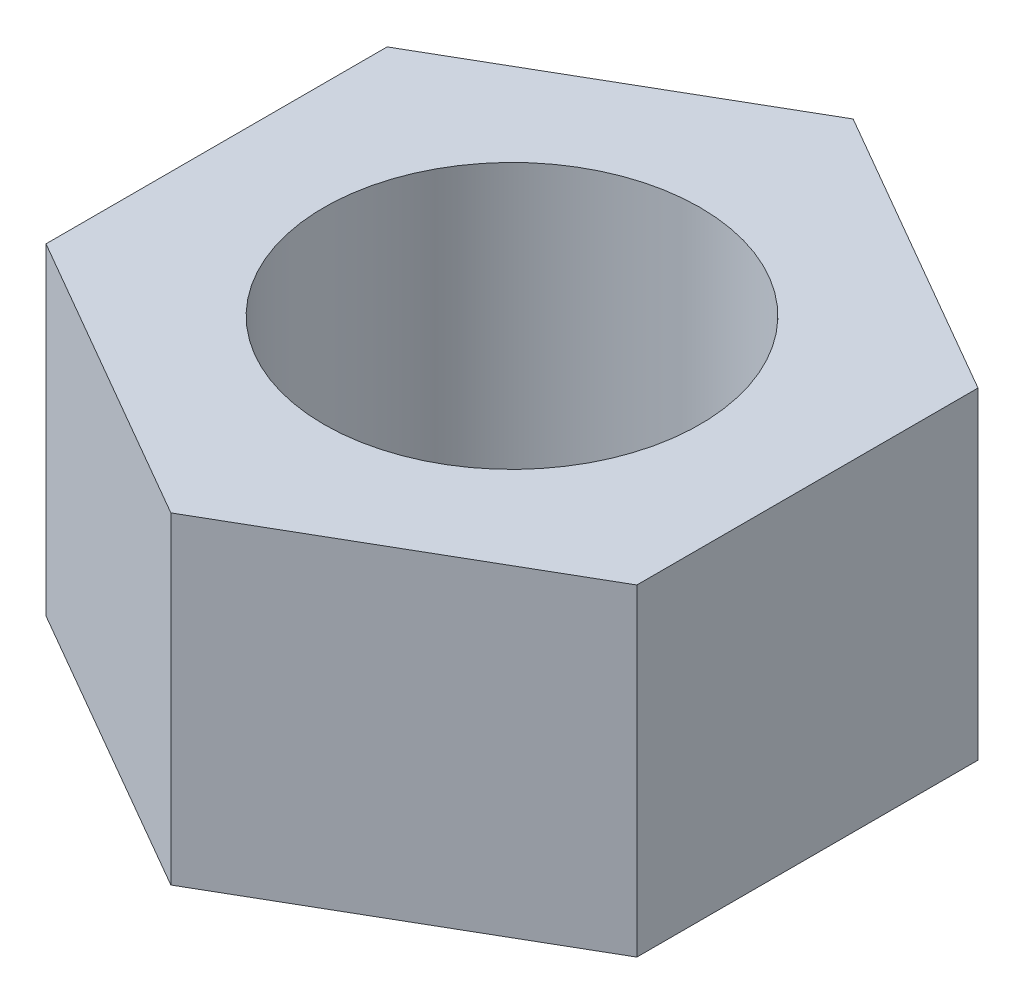
ISO-10303-21;
HEADER;
FILE_DESCRIPTION(('STEP AP214'),'2;1');
FILE_NAME('part.step','',(''),(''),'','','');
FILE_SCHEMA(('AUTOMOTIVE_DESIGN { 1 0 10303 214 1 1 1 1 }'));
ENDSEC;
DATA;
#1=APPLICATION_CONTEXT('core data for automotive mechanical design processes');
#2=APPLICATION_PROTOCOL_DEFINITION('international standard','automotive_design',2000,#1);
#3=PRODUCT_CONTEXT('',#1,'mechanical');
#4=PRODUCT('Part','Part','',(#3));
#5=PRODUCT_RELATED_PRODUCT_CATEGORY('part','',(#4));
#6=PRODUCT_DEFINITION_FORMATION('','',#4);
#7=PRODUCT_DEFINITION_CONTEXT('part definition',#1,'design');
#8=PRODUCT_DEFINITION('design','',#6,#7);
#9=PRODUCT_DEFINITION_SHAPE('','',#8);
#10=(LENGTH_UNIT() NAMED_UNIT(*) SI_UNIT(.MILLI.,.METRE.));
#11=(NAMED_UNIT(*) PLANE_ANGLE_UNIT() SI_UNIT($,.RADIAN.));
#12=(NAMED_UNIT(*) SI_UNIT($,.STERADIAN.) SOLID_ANGLE_UNIT());
#13=UNCERTAINTY_MEASURE_WITH_UNIT(LENGTH_MEASURE(1.E-05),#10,'distance_accuracy_value','');
#14=(GEOMETRIC_REPRESENTATION_CONTEXT(3) GLOBAL_UNCERTAINTY_ASSIGNED_CONTEXT((#13)) GLOBAL_UNIT_ASSIGNED_CONTEXT((#10,
#11,#12)) REPRESENTATION_CONTEXT('',''));
#15=CARTESIAN_POINT('',(0.,0.,0.));
#16=DIRECTION('',(0.,0.,1.));
#17=DIRECTION('',(1.,0.,0.));
#18=AXIS2_PLACEMENT_3D('',#15,#16,#17);
#19=CARTESIAN_POINT('',(5.49999999999997,6.,-3.17542648054301));
#20=DIRECTION('',(-0.499999999999995,0.,0.866025403784441));
#21=DIRECTION('',(0.866025403784442,0.,0.499999999999995));
#22=AXIS2_PLACEMENT_3D('',#19,#20,#21);
#23=PLANE('',#22);
#24=DIRECTION('',(-0.866025403784442,0.,-0.499999999999995));
#25=VECTOR('',#24,1.);
#26=CARTESIAN_POINT('',(5.49999999999997,0.,-3.17542648054301));
#27=LINE('',#26,#25);
#28=CARTESIAN_POINT('',(5.49999999999997,0.,-3.17542648054301));
#29=VERTEX_POINT('',#28);
#30=CARTESIAN_POINT('',(0.,0.,-6.35085296108589));
#31=VERTEX_POINT('',#30);
#32=EDGE_CURVE('E117',#29,#31,#27,.T.);
#33=ORIENTED_EDGE('',*,*,#32,.T.);
#34=DIRECTION('',(0.,-1.,0.));
#35=VECTOR('',#34,1.);
#36=CARTESIAN_POINT('',(0.,6.,-6.35085296108589));
#37=LINE('',#36,#35);
#38=CARTESIAN_POINT('',(0.,6.,-6.35085296108589));
#39=VERTEX_POINT('',#38);
#40=EDGE_CURVE('E11',#39,#31,#37,.T.);
#41=ORIENTED_EDGE('',*,*,#40,.F.);
#42=DIRECTION('',(-0.866025403784442,0.,-0.499999999999995));
#43=VECTOR('',#42,1.);
#44=CARTESIAN_POINT('',(5.49999999999997,6.,-3.17542648054301));
#45=LINE('',#44,#43);
#46=CARTESIAN_POINT('',(5.49999999999997,6.,-3.17542648054301));
#47=VERTEX_POINT('',#46);
#48=EDGE_CURVE('E128',#47,#39,#45,.T.);
#49=ORIENTED_EDGE('',*,*,#48,.F.);
#50=DIRECTION('',(0.,-1.,0.));
#51=VECTOR('',#50,1.);
#52=CARTESIAN_POINT('',(5.49999999999997,6.,-3.17542648054301));
#53=LINE('',#52,#51);
#54=EDGE_CURVE('E113',#47,#29,#53,.T.);
#55=ORIENTED_EDGE('',*,*,#54,.T.);
#56=EDGE_LOOP('',(#33,#41,#49,#55));
#57=FACE_BOUND('',#56,.T.);
#58=ADVANCED_FACE('F33',(#57),#23,.F.);
#59=CARTESIAN_POINT('',(0.,6.,-6.35085296108589));
#60=DIRECTION('',(0.500000000000001,0.,0.866025403784438));
#61=DIRECTION('',(0.866025403784438,0.,-0.500000000000001));
#62=AXIS2_PLACEMENT_3D('',#59,#60,#61);
#63=PLANE('',#62);
#64=DIRECTION('',(-0.866025403784438,0.,0.500000000000001));
#65=VECTOR('',#64,1.);
#66=CARTESIAN_POINT('',(0.,0.,-6.35085296108589));
#67=LINE('',#66,#65);
#68=CARTESIAN_POINT('',(-5.50000000000001,0.,-3.17542648054293));
#69=VERTEX_POINT('',#68);
#70=EDGE_CURVE('E120',#31,#69,#67,.T.);
#71=ORIENTED_EDGE('',*,*,#70,.T.);
#72=DIRECTION('',(0.,-1.,0.));
#73=VECTOR('',#72,1.);
#74=CARTESIAN_POINT('',(-5.50000000000001,6.,-3.17542648054293));
#75=LINE('',#74,#73);
#76=CARTESIAN_POINT('',(-5.50000000000001,6.,-3.17542648054293));
#77=VERTEX_POINT('',#76);
#78=EDGE_CURVE('E41',#77,#69,#75,.T.);
#79=ORIENTED_EDGE('',*,*,#78,.F.);
#80=DIRECTION('',(-0.866025403784438,0.,0.500000000000001));
#81=VECTOR('',#80,1.);
#82=CARTESIAN_POINT('',(0.,6.,-6.35085296108589));
#83=LINE('',#82,#81);
#84=EDGE_CURVE('E86',#39,#77,#83,.T.);
#85=ORIENTED_EDGE('',*,*,#84,.F.);
#86=ORIENTED_EDGE('',*,*,#40,.T.);
#87=EDGE_LOOP('',(#71,#79,#85,#86));
#88=FACE_BOUND('',#87,.T.);
#89=ADVANCED_FACE('F153',(#88),#63,.F.);
#90=CARTESIAN_POINT('',(-5.50000000000001,6.,-3.17542648054293));
#91=DIRECTION('',(1.,0.,0.));
#92=DIRECTION('',(0.,0.,-1.));
#93=AXIS2_PLACEMENT_3D('',#90,#91,#92);
#94=PLANE('',#93);
#95=DIRECTION('',(0.,0.,1.));
#96=VECTOR('',#95,1.);
#97=CARTESIAN_POINT('',(-5.50000000000001,0.,-3.17542648054293));
#98=LINE('',#97,#96);
#99=CARTESIAN_POINT('',(-5.49999999999999,0.,3.17542648054297));
#100=VERTEX_POINT('',#99);
#101=EDGE_CURVE('E123',#69,#100,#98,.T.);
#102=ORIENTED_EDGE('',*,*,#101,.T.);
#103=DIRECTION('',(0.,-1.,0.));
#104=VECTOR('',#103,1.);
#105=CARTESIAN_POINT('',(-5.49999999999999,6.,3.17542648054297));
#106=LINE('',#105,#104);
#107=CARTESIAN_POINT('',(-5.49999999999999,6.,3.17542648054297));
#108=VERTEX_POINT('',#107);
#109=EDGE_CURVE('E108',#108,#100,#106,.T.);
#110=ORIENTED_EDGE('',*,*,#109,.F.);
#111=DIRECTION('',(0.,0.,1.));
#112=VECTOR('',#111,1.);
#113=CARTESIAN_POINT('',(-5.50000000000001,6.,-3.17542648054293));
#114=LINE('',#113,#112);
#115=EDGE_CURVE('E99',#77,#108,#114,.T.);
#116=ORIENTED_EDGE('',*,*,#115,.F.);
#117=ORIENTED_EDGE('',*,*,#78,.T.);
#118=EDGE_LOOP('',(#102,#110,#116,#117));
#119=FACE_BOUND('',#118,.T.);
#120=ADVANCED_FACE('F134',(#119),#94,.F.);
#121=CARTESIAN_POINT('',(-5.49999999999999,6.,3.17542648054297));
#122=DIRECTION('',(0.499999999999995,0.,-0.866025403784441));
#123=DIRECTION('',(-0.866025403784441,0.,-0.499999999999995));
#124=AXIS2_PLACEMENT_3D('',#121,#122,#123);
#125=PLANE('',#124);
#126=DIRECTION('',(0.866025403784441,0.,0.499999999999995));
#127=VECTOR('',#126,1.);
#128=CARTESIAN_POINT('',(-5.49999999999999,0.,3.17542648054297));
#129=LINE('',#128,#127);
#130=CARTESIAN_POINT('',(0.,0.,6.35085296108589));
#131=VERTEX_POINT('',#130);
#132=EDGE_CURVE('E107',#100,#131,#129,.T.);
#133=ORIENTED_EDGE('',*,*,#132,.T.);
#134=DIRECTION('',(0.,-1.,0.));
#135=VECTOR('',#134,1.);
#136=CARTESIAN_POINT('',(0.,6.,6.35085296108589));
#137=LINE('',#136,#135);
#138=CARTESIAN_POINT('',(0.,6.,6.35085296108589));
#139=VERTEX_POINT('',#138);
#140=EDGE_CURVE('E104',#139,#131,#137,.T.);
#141=ORIENTED_EDGE('',*,*,#140,.F.);
#142=DIRECTION('',(0.866025403784441,0.,0.499999999999995));
#143=VECTOR('',#142,1.);
#144=CARTESIAN_POINT('',(-5.49999999999999,6.,3.17542648054297));
#145=LINE('',#144,#143);
#146=EDGE_CURVE('E93',#108,#139,#145,.T.);
#147=ORIENTED_EDGE('',*,*,#146,.F.);
#148=ORIENTED_EDGE('',*,*,#109,.T.);
#149=EDGE_LOOP('',(#133,#141,#147,#148));
#150=FACE_BOUND('',#149,.T.);
#151=ADVANCED_FACE('F105',(#150),#125,.F.);
#152=CARTESIAN_POINT('',(0.,6.,6.35085296108589));
#153=DIRECTION('',(-0.500000000000007,0.,-0.866025403784434));
#154=DIRECTION('',(-0.866025403784435,0.,0.500000000000007));
#155=AXIS2_PLACEMENT_3D('',#152,#153,#154);
#156=PLANE('',#155);
#157=DIRECTION('',(0.866025403784435,0.,-0.500000000000007));
#158=VECTOR('',#157,1.);
#159=CARTESIAN_POINT('',(0.,0.,6.35085296108589));
#160=LINE('',#159,#158);
#161=CARTESIAN_POINT('',(5.50000000000003,0.,3.17542648054289));
#162=VERTEX_POINT('',#161);
#163=EDGE_CURVE('E72',#131,#162,#160,.T.);
#164=ORIENTED_EDGE('',*,*,#163,.T.);
#165=DIRECTION('',(0.,-1.,0.));
#166=VECTOR('',#165,1.);
#167=CARTESIAN_POINT('',(5.50000000000003,6.,3.17542648054289));
#168=LINE('',#167,#166);
#169=CARTESIAN_POINT('',(5.50000000000003,6.,3.17542648054289));
#170=VERTEX_POINT('',#169);
#171=EDGE_CURVE('E109',#170,#162,#168,.T.);
#172=ORIENTED_EDGE('',*,*,#171,.F.);
#173=DIRECTION('',(0.866025403784435,0.,-0.500000000000007));
#174=VECTOR('',#173,1.);
#175=CARTESIAN_POINT('',(0.,6.,6.35085296108589));
#176=LINE('',#175,#174);
#177=EDGE_CURVE('E97',#139,#170,#176,.T.);
#178=ORIENTED_EDGE('',*,*,#177,.F.);
#179=ORIENTED_EDGE('',*,*,#140,.T.);
#180=EDGE_LOOP('',(#164,#172,#178,#179));
#181=FACE_BOUND('',#180,.T.);
#182=ADVANCED_FACE('F111',(#181),#156,.F.);
#183=CARTESIAN_POINT('',(5.50000000000003,6.,3.17542648054289));
#184=DIRECTION('',(-1.,0.,0.));
#185=DIRECTION('',(0.,0.,1.));
#186=AXIS2_PLACEMENT_3D('',#183,#184,#185);
#187=PLANE('',#186);
#188=DIRECTION('',(0.,0.,-1.));
#189=VECTOR('',#188,1.);
#190=CARTESIAN_POINT('',(5.50000000000003,0.,3.17542648054289));
#191=LINE('',#190,#189);
#192=EDGE_CURVE('E78',#162,#29,#191,.T.);
#193=ORIENTED_EDGE('',*,*,#192,.T.);
#194=ORIENTED_EDGE('',*,*,#54,.F.);
#195=DIRECTION('',(0.,0.,-1.));
#196=VECTOR('',#195,1.);
#197=CARTESIAN_POINT('',(5.50000000000003,6.,3.17542648054289));
#198=LINE('',#197,#196);
#199=EDGE_CURVE('E49',#170,#47,#198,.T.);
#200=ORIENTED_EDGE('',*,*,#199,.F.);
#201=ORIENTED_EDGE('',*,*,#171,.T.);
#202=EDGE_LOOP('',(#193,#194,#200,#201));
#203=FACE_BOUND('',#202,.T.);
#204=ADVANCED_FACE('F141',(#203),#187,.F.);
#205=CARTESIAN_POINT('',(0.,6.,0.));
#206=DIRECTION('',(0.,1.,0.));
#207=DIRECTION('',(0.,0.,1.));
#208=AXIS2_PLACEMENT_3D('',#205,#206,#207);
#209=PLANE('',#208);
#210=CARTESIAN_POINT('',(0.,6.,0.));
#211=DIRECTION('',(0.,1.,0.));
#212=DIRECTION('',(0.,0.,1.));
#213=AXIS2_PLACEMENT_3D('',#210,#211,#212);
#214=CIRCLE('',#213,3.5);
#215=CARTESIAN_POINT('',(0.,6.,3.5));
#216=VERTEX_POINT('',#215);
#217=EDGE_CURVE('E208',#216,#216,#214,.T.);
#218=ORIENTED_EDGE('',*,*,#217,.F.);
#219=EDGE_LOOP('',(#218));
#220=FACE_BOUND('',#219,.T.);
#221=ORIENTED_EDGE('',*,*,#48,.T.);
#222=ORIENTED_EDGE('',*,*,#84,.T.);
#223=ORIENTED_EDGE('',*,*,#115,.T.);
#224=ORIENTED_EDGE('',*,*,#146,.T.);
#225=ORIENTED_EDGE('',*,*,#177,.T.);
#226=ORIENTED_EDGE('',*,*,#199,.T.);
#227=EDGE_LOOP('',(#221,#222,#223,#224,#225,#226));
#228=FACE_BOUND('',#227,.T.);
#229=ADVANCED_FACE('F95',(#220,#228),#209,.T.);
#230=CARTESIAN_POINT('',(0.,0.,0.));
#231=DIRECTION('',(0.,1.,0.));
#232=DIRECTION('',(0.,0.,1.));
#233=AXIS2_PLACEMENT_3D('',#230,#231,#232);
#234=PLANE('',#233);
#235=CARTESIAN_POINT('',(0.,0.,0.));
#236=DIRECTION('',(0.,1.,0.));
#237=DIRECTION('',(0.,0.,1.));
#238=AXIS2_PLACEMENT_3D('',#235,#236,#237);
#239=CIRCLE('',#238,3.5);
#240=CARTESIAN_POINT('',(0.,0.,3.5));
#241=VERTEX_POINT('',#240);
#242=EDGE_CURVE('E121',#241,#241,#239,.T.);
#243=ORIENTED_EDGE('',*,*,#242,.T.);
#244=EDGE_LOOP('',(#243));
#245=FACE_BOUND('',#244,.T.);
#246=ORIENTED_EDGE('',*,*,#32,.F.);
#247=ORIENTED_EDGE('',*,*,#192,.F.);
#248=ORIENTED_EDGE('',*,*,#163,.F.);
#249=ORIENTED_EDGE('',*,*,#132,.F.);
#250=ORIENTED_EDGE('',*,*,#101,.F.);
#251=ORIENTED_EDGE('',*,*,#70,.F.);
#252=EDGE_LOOP('',(#246,#247,#248,#249,#250,#251));
#253=FACE_BOUND('',#252,.T.);
#254=ADVANCED_FACE('F137',(#245,#253),#234,.F.);
#255=CARTESIAN_POINT('',(0.,0.,0.));
#256=DIRECTION('',(0.,1.,0.));
#257=DIRECTION('',(0.,0.,1.));
#258=AXIS2_PLACEMENT_3D('',#255,#256,#257);
#259=CYLINDRICAL_SURFACE('',#258,3.5);
#260=ORIENTED_EDGE('',*,*,#242,.F.);
#261=EDGE_LOOP('',(#260));
#262=FACE_BOUND('',#261,.T.);
#263=ORIENTED_EDGE('',*,*,#217,.T.);
#264=EDGE_LOOP('',(#263));
#265=FACE_BOUND('',#264,.T.);
#266=ADVANCED_FACE('F190',(#262,#265),#259,.F.);
#267=CLOSED_SHELL('',(#58,#89,#120,#151,#182,#204,#229,#254,#266));
#268=MANIFOLD_SOLID_BREP('B2',#267);
#269=ADVANCED_BREP_SHAPE_REPRESENTATION('',(#18,#268),#14);
#270=SHAPE_DEFINITION_REPRESENTATION(#9,#269);
ENDSEC;
END-ISO-10303-21;
